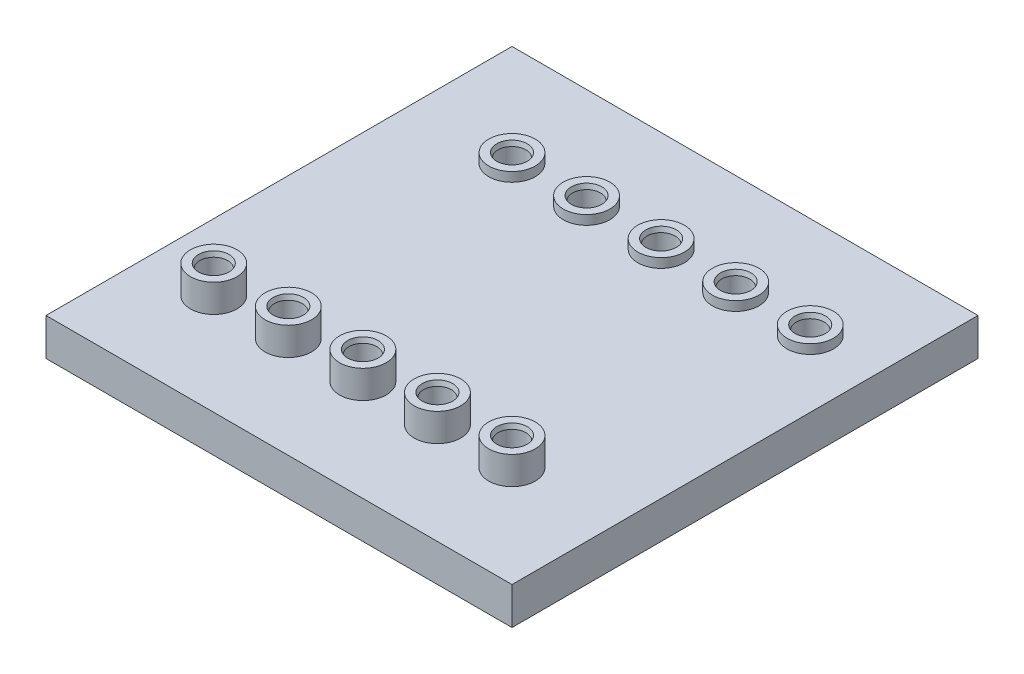
ISO-10303-21;
HEADER;
FILE_DESCRIPTION(('STEP AP214'),'2;1');
FILE_NAME('part.step','',(''),(''),'','','');
FILE_SCHEMA(('AUTOMOTIVE_DESIGN { 1 0 10303 214 1 1 1 1 }'));
ENDSEC;
DATA;
#1=APPLICATION_CONTEXT('core data for automotive mechanical design processes');
#2=APPLICATION_PROTOCOL_DEFINITION('international standard','automotive_design',2000,#1);
#3=PRODUCT_CONTEXT('',#1,'mechanical');
#4=PRODUCT('Part','Part','',(#3));
#5=PRODUCT_RELATED_PRODUCT_CATEGORY('part','',(#4));
#6=PRODUCT_DEFINITION_FORMATION('','',#4);
#7=PRODUCT_DEFINITION_CONTEXT('part definition',#1,'design');
#8=PRODUCT_DEFINITION('design','',#6,#7);
#9=PRODUCT_DEFINITION_SHAPE('','',#8);
#10=(LENGTH_UNIT() NAMED_UNIT(*) SI_UNIT(.MILLI.,.METRE.));
#11=(NAMED_UNIT(*) PLANE_ANGLE_UNIT() SI_UNIT($,.RADIAN.));
#12=(NAMED_UNIT(*) SI_UNIT($,.STERADIAN.) SOLID_ANGLE_UNIT());
#13=UNCERTAINTY_MEASURE_WITH_UNIT(LENGTH_MEASURE(1.E-05),#10,'distance_accuracy_value','');
#14=(GEOMETRIC_REPRESENTATION_CONTEXT(3) GLOBAL_UNCERTAINTY_ASSIGNED_CONTEXT((#13)) GLOBAL_UNIT_ASSIGNED_CONTEXT((#10,
#11,#12)) REPRESENTATION_CONTEXT('',''));
#15=CARTESIAN_POINT('',(0.,0.,0.));
#16=DIRECTION('',(0.,0.,1.));
#17=DIRECTION('',(1.,0.,0.));
#18=AXIS2_PLACEMENT_3D('',#15,#16,#17);
#19=CARTESIAN_POINT('',(-25.,4.,25.));
#20=DIRECTION('',(-1.,0.,0.));
#21=DIRECTION('',(0.,0.,1.));
#22=AXIS2_PLACEMENT_3D('',#19,#20,#21);
#23=PLANE('',#22);
#24=DIRECTION('',(0.,0.,-1.));
#25=VECTOR('',#24,1.);
#26=CARTESIAN_POINT('',(-25.,0.,25.));
#27=LINE('',#26,#25);
#28=CARTESIAN_POINT('',(-25.,0.,25.));
#29=VERTEX_POINT('',#28);
#30=CARTESIAN_POINT('',(-25.,0.,-25.));
#31=VERTEX_POINT('',#30);
#32=EDGE_CURVE('E99',#29,#31,#27,.T.);
#33=ORIENTED_EDGE('',*,*,#32,.F.);
#34=DIRECTION('',(0.,-1.,0.));
#35=VECTOR('',#34,1.);
#36=CARTESIAN_POINT('',(-25.,4.,25.));
#37=LINE('',#36,#35);
#38=CARTESIAN_POINT('',(-25.,4.,25.));
#39=VERTEX_POINT('',#38);
#40=EDGE_CURVE('E11',#39,#29,#37,.T.);
#41=ORIENTED_EDGE('',*,*,#40,.F.);
#42=DIRECTION('',(0.,0.,-1.));
#43=VECTOR('',#42,1.);
#44=CARTESIAN_POINT('',(-25.,4.,25.));
#45=LINE('',#44,#43);
#46=CARTESIAN_POINT('',(-25.,4.,-25.));
#47=VERTEX_POINT('',#46);
#48=EDGE_CURVE('E93',#39,#47,#45,.T.);
#49=ORIENTED_EDGE('',*,*,#48,.T.);
#50=DIRECTION('',(0.,-1.,0.));
#51=VECTOR('',#50,1.);
#52=CARTESIAN_POINT('',(-25.,4.,-25.));
#53=LINE('',#52,#51);
#54=EDGE_CURVE('E36',#47,#31,#53,.T.);
#55=ORIENTED_EDGE('',*,*,#54,.T.);
#56=EDGE_LOOP('',(#33,#41,#49,#55));
#57=FACE_BOUND('',#56,.T.);
#58=ADVANCED_FACE('F33',(#57),#23,.T.);
#59=CARTESIAN_POINT('',(-25.,4.,25.));
#60=DIRECTION('',(0.,0.,-1.));
#61=DIRECTION('',(-1.,0.,0.));
#62=AXIS2_PLACEMENT_3D('',#59,#60,#61);
#63=PLANE('',#62);
#64=DIRECTION('',(1.,0.,0.));
#65=VECTOR('',#64,1.);
#66=CARTESIAN_POINT('',(-25.,0.,25.));
#67=LINE('',#66,#65);
#68=CARTESIAN_POINT('',(25.,0.,25.));
#69=VERTEX_POINT('',#68);
#70=EDGE_CURVE('E66',#29,#69,#67,.T.);
#71=ORIENTED_EDGE('',*,*,#70,.T.);
#72=DIRECTION('',(0.,-1.,0.));
#73=VECTOR('',#72,1.);
#74=CARTESIAN_POINT('',(25.,4.,25.));
#75=LINE('',#74,#73);
#76=CARTESIAN_POINT('',(25.,4.,25.));
#77=VERTEX_POINT('',#76);
#78=EDGE_CURVE('E42',#77,#69,#75,.T.);
#79=ORIENTED_EDGE('',*,*,#78,.F.);
#80=DIRECTION('',(1.,0.,0.));
#81=VECTOR('',#80,1.);
#82=CARTESIAN_POINT('',(-25.,4.,25.));
#83=LINE('',#82,#81);
#84=EDGE_CURVE('E83',#39,#77,#83,.T.);
#85=ORIENTED_EDGE('',*,*,#84,.F.);
#86=ORIENTED_EDGE('',*,*,#40,.T.);
#87=EDGE_LOOP('',(#71,#79,#85,#86));
#88=FACE_BOUND('',#87,.T.);
#89=ADVANCED_FACE('F110',(#88),#63,.F.);
#90=CARTESIAN_POINT('',(25.,4.,25.));
#91=DIRECTION('',(-1.,0.,0.));
#92=DIRECTION('',(0.,0.,1.));
#93=AXIS2_PLACEMENT_3D('',#90,#91,#92);
#94=PLANE('',#93);
#95=DIRECTION('',(0.,0.,-1.));
#96=VECTOR('',#95,1.);
#97=CARTESIAN_POINT('',(25.,0.,25.));
#98=LINE('',#97,#96);
#99=CARTESIAN_POINT('',(25.,0.,-25.));
#100=VERTEX_POINT('',#99);
#101=EDGE_CURVE('E90',#69,#100,#98,.T.);
#102=ORIENTED_EDGE('',*,*,#101,.T.);
#103=DIRECTION('',(0.,-1.,0.));
#104=VECTOR('',#103,1.);
#105=CARTESIAN_POINT('',(25.,4.,-25.));
#106=LINE('',#105,#104);
#107=CARTESIAN_POINT('',(25.,4.,-25.));
#108=VERTEX_POINT('',#107);
#109=EDGE_CURVE('E87',#108,#100,#106,.T.);
#110=ORIENTED_EDGE('',*,*,#109,.F.);
#111=DIRECTION('',(0.,0.,-1.));
#112=VECTOR('',#111,1.);
#113=CARTESIAN_POINT('',(25.,4.,25.));
#114=LINE('',#113,#112);
#115=EDGE_CURVE('E78',#77,#108,#114,.T.);
#116=ORIENTED_EDGE('',*,*,#115,.F.);
#117=ORIENTED_EDGE('',*,*,#78,.T.);
#118=EDGE_LOOP('',(#102,#110,#116,#117));
#119=FACE_BOUND('',#118,.T.);
#120=ADVANCED_FACE('F88',(#119),#94,.F.);
#121=CARTESIAN_POINT('',(-25.,4.,-25.));
#122=DIRECTION('',(0.,0.,-1.));
#123=DIRECTION('',(-1.,0.,0.));
#124=AXIS2_PLACEMENT_3D('',#121,#122,#123);
#125=PLANE('',#124);
#126=DIRECTION('',(1.,0.,0.));
#127=VECTOR('',#126,1.);
#128=CARTESIAN_POINT('',(-25.,0.,-25.));
#129=LINE('',#128,#127);
#130=EDGE_CURVE('E102',#31,#100,#129,.T.);
#131=ORIENTED_EDGE('',*,*,#130,.F.);
#132=ORIENTED_EDGE('',*,*,#54,.F.);
#133=DIRECTION('',(1.,0.,0.));
#134=VECTOR('',#133,1.);
#135=CARTESIAN_POINT('',(-25.,4.,-25.));
#136=LINE('',#135,#134);
#137=EDGE_CURVE('E82',#47,#108,#136,.T.);
#138=ORIENTED_EDGE('',*,*,#137,.T.);
#139=ORIENTED_EDGE('',*,*,#109,.T.);
#140=EDGE_LOOP('',(#131,#132,#138,#139));
#141=FACE_BOUND('',#140,.T.);
#142=ADVANCED_FACE('F92',(#141),#125,.T.);
#143=CARTESIAN_POINT('',(0.,4.,0.));
#144=DIRECTION('',(0.,-1.,0.));
#145=DIRECTION('',(0.,0.,-1.));
#146=AXIS2_PLACEMENT_3D('',#143,#144,#145);
#147=PLANE('',#146);
#148=CARTESIAN_POINT('',(6.14213562373095,4.,14.142135623731));
#149=DIRECTION('',(0.,-1.,0.));
#150=DIRECTION('',(0.,0.,-1.));
#151=AXIS2_PLACEMENT_3D('',#148,#149,#150);
#152=CIRCLE('',#151,2.5);
#153=CARTESIAN_POINT('',(6.14213562373095,4.,11.642135623731));
#154=VERTEX_POINT('',#153);
#155=EDGE_CURVE('E428',#154,#154,#152,.T.);
#156=ORIENTED_EDGE('',*,*,#155,.T.);
#157=EDGE_LOOP('',(#156));
#158=FACE_BOUND('',#157,.T.);
#159=CARTESIAN_POINT('',(-1.85786437626905,4.,14.142135623731));
#160=DIRECTION('',(0.,-1.,0.));
#161=DIRECTION('',(0.,0.,-1.));
#162=AXIS2_PLACEMENT_3D('',#159,#160,#161);
#163=CIRCLE('',#162,2.5);
#164=CARTESIAN_POINT('',(-1.85786437626905,4.,11.642135623731));
#165=VERTEX_POINT('',#164);
#166=EDGE_CURVE('E433',#165,#165,#163,.T.);
#167=ORIENTED_EDGE('',*,*,#166,.T.);
#168=EDGE_LOOP('',(#167));
#169=FACE_BOUND('',#168,.T.);
#170=CARTESIAN_POINT('',(-9.85786437626905,4.,14.142135623731));
#171=DIRECTION('',(0.,-1.,0.));
#172=DIRECTION('',(0.,0.,-1.));
#173=AXIS2_PLACEMENT_3D('',#170,#171,#172);
#174=CIRCLE('',#173,2.5);
#175=CARTESIAN_POINT('',(-9.85786437626905,4.,11.642135623731));
#176=VERTEX_POINT('',#175);
#177=EDGE_CURVE('E439',#176,#176,#174,.T.);
#178=ORIENTED_EDGE('',*,*,#177,.T.);
#179=EDGE_LOOP('',(#178));
#180=FACE_BOUND('',#179,.T.);
#181=CARTESIAN_POINT('',(-17.8578643762691,4.,14.142135623731));
#182=DIRECTION('',(0.,-1.,0.));
#183=DIRECTION('',(0.,0.,-1.));
#184=AXIS2_PLACEMENT_3D('',#181,#182,#183);
#185=CIRCLE('',#184,2.5);
#186=CARTESIAN_POINT('',(-17.8578643762691,4.,11.642135623731));
#187=VERTEX_POINT('',#186);
#188=EDGE_CURVE('E445',#187,#187,#185,.T.);
#189=ORIENTED_EDGE('',*,*,#188,.T.);
#190=EDGE_LOOP('',(#189));
#191=FACE_BOUND('',#190,.T.);
#192=CARTESIAN_POINT('',(14.1421356237309,4.,14.142135623731));
#193=DIRECTION('',(0.,-1.,0.));
#194=DIRECTION('',(0.,0.,-1.));
#195=AXIS2_PLACEMENT_3D('',#192,#193,#194);
#196=CIRCLE('',#195,2.5);
#197=CARTESIAN_POINT('',(14.1421356237309,4.,11.6421356237309));
#198=VERTEX_POINT('',#197);
#199=EDGE_CURVE('E448',#198,#198,#196,.T.);
#200=ORIENTED_EDGE('',*,*,#199,.T.);
#201=EDGE_LOOP('',(#200));
#202=FACE_BOUND('',#201,.T.);
#203=CARTESIAN_POINT('',(17.8578643762691,4.,-14.1421356237309));
#204=DIRECTION('',(0.,-1.,0.));
#205=DIRECTION('',(0.,0.,-1.));
#206=AXIS2_PLACEMENT_3D('',#203,#204,#205);
#207=CIRCLE('',#206,2.5);
#208=CARTESIAN_POINT('',(17.8578643762691,4.,-16.6421356237309));
#209=VERTEX_POINT('',#208);
#210=EDGE_CURVE('E457',#209,#209,#207,.T.);
#211=ORIENTED_EDGE('',*,*,#210,.T.);
#212=EDGE_LOOP('',(#211));
#213=FACE_BOUND('',#212,.T.);
#214=CARTESIAN_POINT('',(9.85786437626905,4.,-14.1421356237309));
#215=DIRECTION('',(0.,-1.,0.));
#216=DIRECTION('',(0.,0.,-1.));
#217=AXIS2_PLACEMENT_3D('',#214,#215,#216);
#218=CIRCLE('',#217,2.5);
#219=CARTESIAN_POINT('',(9.85786437626905,4.,-16.642135623731));
#220=VERTEX_POINT('',#219);
#221=EDGE_CURVE('E463',#220,#220,#218,.T.);
#222=ORIENTED_EDGE('',*,*,#221,.T.);
#223=EDGE_LOOP('',(#222));
#224=FACE_BOUND('',#223,.T.);
#225=CARTESIAN_POINT('',(1.85786437626905,4.,-14.1421356237309));
#226=DIRECTION('',(0.,-1.,0.));
#227=DIRECTION('',(0.,0.,-1.));
#228=AXIS2_PLACEMENT_3D('',#225,#226,#227);
#229=CIRCLE('',#228,2.5);
#230=CARTESIAN_POINT('',(1.85786437626905,4.,-16.6421356237309));
#231=VERTEX_POINT('',#230);
#232=EDGE_CURVE('E469',#231,#231,#229,.T.);
#233=ORIENTED_EDGE('',*,*,#232,.T.);
#234=EDGE_LOOP('',(#233));
#235=FACE_BOUND('',#234,.T.);
#236=CARTESIAN_POINT('',(-6.14213562373095,4.,-14.1421356237309));
#237=DIRECTION('',(0.,-1.,0.));
#238=DIRECTION('',(0.,0.,-1.));
#239=AXIS2_PLACEMENT_3D('',#236,#237,#238);
#240=CIRCLE('',#239,2.5);
#241=CARTESIAN_POINT('',(-6.14213562373095,4.,-16.6421356237309));
#242=VERTEX_POINT('',#241);
#243=EDGE_CURVE('E475',#242,#242,#240,.T.);
#244=ORIENTED_EDGE('',*,*,#243,.T.);
#245=EDGE_LOOP('',(#244));
#246=FACE_BOUND('',#245,.T.);
#247=CARTESIAN_POINT('',(-14.142135623731,4.,-14.1421356237309));
#248=DIRECTION('',(0.,-1.,0.));
#249=DIRECTION('',(0.,0.,-1.));
#250=AXIS2_PLACEMENT_3D('',#247,#248,#249);
#251=CIRCLE('',#250,2.5);
#252=CARTESIAN_POINT('',(-14.142135623731,4.,-16.642135623731));
#253=VERTEX_POINT('',#252);
#254=EDGE_CURVE('E478',#253,#253,#251,.T.);
#255=ORIENTED_EDGE('',*,*,#254,.T.);
#256=EDGE_LOOP('',(#255));
#257=FACE_BOUND('',#256,.T.);
#258=ORIENTED_EDGE('',*,*,#48,.F.);
#259=ORIENTED_EDGE('',*,*,#84,.T.);
#260=ORIENTED_EDGE('',*,*,#115,.T.);
#261=ORIENTED_EDGE('',*,*,#137,.F.);
#262=EDGE_LOOP('',(#258,#259,#260,#261));
#263=FACE_BOUND('',#262,.T.);
#264=ADVANCED_FACE('F81',(#158,#169,#180,#191,#202,#213,#224,#235,#246,#257,#263),#147,.F.);
#265=CARTESIAN_POINT('',(0.,0.,0.));
#266=DIRECTION('',(0.,-1.,0.));
#267=DIRECTION('',(0.,0.,-1.));
#268=AXIS2_PLACEMENT_3D('',#265,#266,#267);
#269=PLANE('',#268);
#270=ORIENTED_EDGE('',*,*,#32,.T.);
#271=ORIENTED_EDGE('',*,*,#130,.T.);
#272=ORIENTED_EDGE('',*,*,#101,.F.);
#273=ORIENTED_EDGE('',*,*,#70,.F.);
#274=EDGE_LOOP('',(#270,#271,#272,#273));
#275=FACE_BOUND('',#274,.T.);
#276=ADVANCED_FACE('F108',(#275),#269,.T.);
#277=CARTESIAN_POINT('',(-14.142135623731,5.,-14.1421356237309));
#278=DIRECTION('',(0.,-1.,0.));
#279=DIRECTION('',(0.,0.,-1.));
#280=AXIS2_PLACEMENT_3D('',#277,#278,#279);
#281=CYLINDRICAL_SURFACE('',#280,2.5);
#282=CARTESIAN_POINT('',(-14.142135623731,5.,-14.1421356237309));
#283=DIRECTION('',(0.,-1.,0.));
#284=DIRECTION('',(0.,0.,-1.));
#285=AXIS2_PLACEMENT_3D('',#282,#283,#284);
#286=CIRCLE('',#285,2.5);
#287=CARTESIAN_POINT('',(-14.142135623731,5.,-16.642135623731));
#288=VERTEX_POINT('',#287);
#289=EDGE_CURVE('E103',#288,#288,#286,.T.);
#290=ORIENTED_EDGE('',*,*,#289,.T.);
#291=EDGE_LOOP('',(#290));
#292=FACE_BOUND('',#291,.T.);
#293=ORIENTED_EDGE('',*,*,#254,.F.);
#294=EDGE_LOOP('',(#293));
#295=FACE_BOUND('',#294,.T.);
#296=ADVANCED_FACE('F129',(#292,#295),#281,.T.);
#297=CARTESIAN_POINT('',(-14.142135623731,5.,-14.1421356237309));
#298=DIRECTION('',(0.,-1.,0.));
#299=DIRECTION('',(0.,0.,-1.));
#300=AXIS2_PLACEMENT_3D('',#297,#298,#299);
#301=PLANE('',#300);
#302=CARTESIAN_POINT('',(-14.142135623731,5.,-14.1421356237309));
#303=DIRECTION('',(0.,1.,0.));
#304=DIRECTION('',(0.,0.,1.));
#305=AXIS2_PLACEMENT_3D('',#302,#303,#304);
#306=CIRCLE('',#305,1.635);
#307=CARTESIAN_POINT('',(-14.142135623731,5.,-12.5071356237309));
#308=VERTEX_POINT('',#307);
#309=EDGE_CURVE('E382',#308,#308,#306,.T.);
#310=ORIENTED_EDGE('',*,*,#309,.F.);
#311=EDGE_LOOP('',(#310));
#312=FACE_BOUND('',#311,.T.);
#313=ORIENTED_EDGE('',*,*,#289,.F.);
#314=EDGE_LOOP('',(#313));
#315=FACE_BOUND('',#314,.T.);
#316=ADVANCED_FACE('F135',(#312,#315),#301,.F.);
#317=CARTESIAN_POINT('',(-6.14213562373095,5.,-14.1421356237309));
#318=DIRECTION('',(0.,-1.,0.));
#319=DIRECTION('',(0.,0.,-1.));
#320=AXIS2_PLACEMENT_3D('',#317,#318,#319);
#321=CYLINDRICAL_SURFACE('',#320,2.5);
#322=CARTESIAN_POINT('',(-6.14213562373095,5.,-14.1421356237309));
#323=DIRECTION('',(0.,-1.,0.));
#324=DIRECTION('',(0.,0.,-1.));
#325=AXIS2_PLACEMENT_3D('',#322,#323,#324);
#326=CIRCLE('',#325,2.5);
#327=CARTESIAN_POINT('',(-6.14213562373095,5.,-16.6421356237309));
#328=VERTEX_POINT('',#327);
#329=EDGE_CURVE('E472',#328,#328,#326,.T.);
#330=ORIENTED_EDGE('',*,*,#329,.T.);
#331=EDGE_LOOP('',(#330));
#332=FACE_BOUND('',#331,.T.);
#333=ORIENTED_EDGE('',*,*,#243,.F.);
#334=EDGE_LOOP('',(#333));
#335=FACE_BOUND('',#334,.T.);
#336=ADVANCED_FACE('F139',(#332,#335),#321,.T.);
#337=CARTESIAN_POINT('',(-6.14213562373095,5.,-14.1421356237309));
#338=DIRECTION('',(0.,-1.,0.));
#339=DIRECTION('',(0.,0.,-1.));
#340=AXIS2_PLACEMENT_3D('',#337,#338,#339);
#341=PLANE('',#340);
#342=CARTESIAN_POINT('',(-6.14213562373095,5.,-14.1421356237309));
#343=DIRECTION('',(0.,1.,0.));
#344=DIRECTION('',(0.,0.,1.));
#345=AXIS2_PLACEMENT_3D('',#342,#343,#344);
#346=CIRCLE('',#345,1.635);
#347=CARTESIAN_POINT('',(-6.14213562373095,5.,-12.5071356237309));
#348=VERTEX_POINT('',#347);
#349=EDGE_CURVE('E391',#348,#348,#346,.T.);
#350=ORIENTED_EDGE('',*,*,#349,.F.);
#351=EDGE_LOOP('',(#350));
#352=FACE_BOUND('',#351,.T.);
#353=ORIENTED_EDGE('',*,*,#329,.F.);
#354=EDGE_LOOP('',(#353));
#355=FACE_BOUND('',#354,.T.);
#356=ADVANCED_FACE('F141',(#352,#355),#341,.F.);
#357=CARTESIAN_POINT('',(1.85786437626905,5.,-14.1421356237309));
#358=DIRECTION('',(0.,-1.,0.));
#359=DIRECTION('',(0.,0.,-1.));
#360=AXIS2_PLACEMENT_3D('',#357,#358,#359);
#361=CYLINDRICAL_SURFACE('',#360,2.5);
#362=CARTESIAN_POINT('',(1.85786437626905,5.,-14.1421356237309));
#363=DIRECTION('',(0.,-1.,0.));
#364=DIRECTION('',(0.,0.,-1.));
#365=AXIS2_PLACEMENT_3D('',#362,#363,#364);
#366=CIRCLE('',#365,2.5);
#367=CARTESIAN_POINT('',(1.85786437626905,5.,-16.6421356237309));
#368=VERTEX_POINT('',#367);
#369=EDGE_CURVE('E466',#368,#368,#366,.T.);
#370=ORIENTED_EDGE('',*,*,#369,.T.);
#371=EDGE_LOOP('',(#370));
#372=FACE_BOUND('',#371,.T.);
#373=ORIENTED_EDGE('',*,*,#232,.F.);
#374=EDGE_LOOP('',(#373));
#375=FACE_BOUND('',#374,.T.);
#376=ADVANCED_FACE('F144',(#372,#375),#361,.T.);
#377=CARTESIAN_POINT('',(1.85786437626905,5.,-14.1421356237309));
#378=DIRECTION('',(0.,-1.,0.));
#379=DIRECTION('',(0.,0.,-1.));
#380=AXIS2_PLACEMENT_3D('',#377,#378,#379);
#381=PLANE('',#380);
#382=CARTESIAN_POINT('',(1.85786437626905,5.,-14.1421356237309));
#383=DIRECTION('',(0.,1.,0.));
#384=DIRECTION('',(0.,0.,1.));
#385=AXIS2_PLACEMENT_3D('',#382,#383,#384);
#386=CIRCLE('',#385,1.635);
#387=CARTESIAN_POINT('',(1.85786437626905,5.,-12.5071356237309));
#388=VERTEX_POINT('',#387);
#389=EDGE_CURVE('E400',#388,#388,#386,.T.);
#390=ORIENTED_EDGE('',*,*,#389,.F.);
#391=EDGE_LOOP('',(#390));
#392=FACE_BOUND('',#391,.T.);
#393=ORIENTED_EDGE('',*,*,#369,.F.);
#394=EDGE_LOOP('',(#393));
#395=FACE_BOUND('',#394,.T.);
#396=ADVANCED_FACE('F149',(#392,#395),#381,.F.);
#397=CARTESIAN_POINT('',(9.85786437626905,5.,-14.1421356237309));
#398=DIRECTION('',(0.,-1.,0.));
#399=DIRECTION('',(0.,0.,-1.));
#400=AXIS2_PLACEMENT_3D('',#397,#398,#399);
#401=CYLINDRICAL_SURFACE('',#400,2.5);
#402=CARTESIAN_POINT('',(9.85786437626905,5.,-14.1421356237309));
#403=DIRECTION('',(0.,-1.,0.));
#404=DIRECTION('',(0.,0.,-1.));
#405=AXIS2_PLACEMENT_3D('',#402,#403,#404);
#406=CIRCLE('',#405,2.5);
#407=CARTESIAN_POINT('',(9.85786437626905,5.,-16.642135623731));
#408=VERTEX_POINT('',#407);
#409=EDGE_CURVE('E460',#408,#408,#406,.T.);
#410=ORIENTED_EDGE('',*,*,#409,.T.);
#411=EDGE_LOOP('',(#410));
#412=FACE_BOUND('',#411,.T.);
#413=ORIENTED_EDGE('',*,*,#221,.F.);
#414=EDGE_LOOP('',(#413));
#415=FACE_BOUND('',#414,.T.);
#416=ADVANCED_FACE('F152',(#412,#415),#401,.T.);
#417=CARTESIAN_POINT('',(9.85786437626905,5.,-14.1421356237309));
#418=DIRECTION('',(0.,-1.,0.));
#419=DIRECTION('',(0.,0.,-1.));
#420=AXIS2_PLACEMENT_3D('',#417,#418,#419);
#421=PLANE('',#420);
#422=CARTESIAN_POINT('',(9.85786437626905,5.,-14.1421356237309));
#423=DIRECTION('',(0.,1.,0.));
#424=DIRECTION('',(0.,0.,1.));
#425=AXIS2_PLACEMENT_3D('',#422,#423,#424);
#426=CIRCLE('',#425,1.635);
#427=CARTESIAN_POINT('',(9.85786437626905,5.,-12.5071356237309));
#428=VERTEX_POINT('',#427);
#429=EDGE_CURVE('E409',#428,#428,#426,.T.);
#430=ORIENTED_EDGE('',*,*,#429,.F.);
#431=EDGE_LOOP('',(#430));
#432=FACE_BOUND('',#431,.T.);
#433=ORIENTED_EDGE('',*,*,#409,.F.);
#434=EDGE_LOOP('',(#433));
#435=FACE_BOUND('',#434,.T.);
#436=ADVANCED_FACE('F157',(#432,#435),#421,.F.);
#437=CARTESIAN_POINT('',(17.8578643762691,5.,-14.1421356237309));
#438=DIRECTION('',(0.,-1.,0.));
#439=DIRECTION('',(0.,0.,-1.));
#440=AXIS2_PLACEMENT_3D('',#437,#438,#439);
#441=CYLINDRICAL_SURFACE('',#440,2.5);
#442=CARTESIAN_POINT('',(17.8578643762691,5.,-14.1421356237309));
#443=DIRECTION('',(0.,-1.,0.));
#444=DIRECTION('',(0.,0.,-1.));
#445=AXIS2_PLACEMENT_3D('',#442,#443,#444);
#446=CIRCLE('',#445,2.5);
#447=CARTESIAN_POINT('',(17.8578643762691,5.,-16.6421356237309));
#448=VERTEX_POINT('',#447);
#449=EDGE_CURVE('E454',#448,#448,#446,.T.);
#450=ORIENTED_EDGE('',*,*,#449,.T.);
#451=EDGE_LOOP('',(#450));
#452=FACE_BOUND('',#451,.T.);
#453=ORIENTED_EDGE('',*,*,#210,.F.);
#454=EDGE_LOOP('',(#453));
#455=FACE_BOUND('',#454,.T.);
#456=ADVANCED_FACE('F160',(#452,#455),#441,.T.);
#457=CARTESIAN_POINT('',(17.8578643762691,5.,-14.1421356237309));
#458=DIRECTION('',(0.,-1.,0.));
#459=DIRECTION('',(0.,0.,-1.));
#460=AXIS2_PLACEMENT_3D('',#457,#458,#459);
#461=PLANE('',#460);
#462=CARTESIAN_POINT('',(17.8578643762691,5.,-14.1421356237309));
#463=DIRECTION('',(0.,1.,0.));
#464=DIRECTION('',(0.,0.,1.));
#465=AXIS2_PLACEMENT_3D('',#462,#463,#464);
#466=CIRCLE('',#465,1.635);
#467=CARTESIAN_POINT('',(17.8578643762691,5.,-12.507135623731));
#468=VERTEX_POINT('',#467);
#469=EDGE_CURVE('E418',#468,#468,#466,.T.);
#470=ORIENTED_EDGE('',*,*,#469,.F.);
#471=EDGE_LOOP('',(#470));
#472=FACE_BOUND('',#471,.T.);
#473=ORIENTED_EDGE('',*,*,#449,.F.);
#474=EDGE_LOOP('',(#473));
#475=FACE_BOUND('',#474,.T.);
#476=ADVANCED_FACE('F165',(#472,#475),#461,.F.);
#477=CARTESIAN_POINT('',(14.1421356237309,7.,14.142135623731));
#478=DIRECTION('',(0.,-1.,0.));
#479=DIRECTION('',(0.,0.,-1.));
#480=AXIS2_PLACEMENT_3D('',#477,#478,#479);
#481=CYLINDRICAL_SURFACE('',#480,2.5);
#482=CARTESIAN_POINT('',(14.1421356237309,7.,14.142135623731));
#483=DIRECTION('',(0.,-1.,0.));
#484=DIRECTION('',(0.,0.,-1.));
#485=AXIS2_PLACEMENT_3D('',#482,#483,#484);
#486=CIRCLE('',#485,2.5);
#487=CARTESIAN_POINT('',(14.1421356237309,7.,11.6421356237309));
#488=VERTEX_POINT('',#487);
#489=EDGE_CURVE('E451',#488,#488,#486,.T.);
#490=ORIENTED_EDGE('',*,*,#489,.T.);
#491=EDGE_LOOP('',(#490));
#492=FACE_BOUND('',#491,.T.);
#493=ORIENTED_EDGE('',*,*,#199,.F.);
#494=EDGE_LOOP('',(#493));
#495=FACE_BOUND('',#494,.T.);
#496=ADVANCED_FACE('F168',(#492,#495),#481,.T.);
#497=CARTESIAN_POINT('',(14.1421356237309,7.,14.142135623731));
#498=DIRECTION('',(0.,-1.,0.));
#499=DIRECTION('',(0.,0.,-1.));
#500=AXIS2_PLACEMENT_3D('',#497,#498,#499);
#501=PLANE('',#500);
#502=CARTESIAN_POINT('',(14.1421356237309,7.,14.142135623731));
#503=DIRECTION('',(0.,1.,0.));
#504=DIRECTION('',(0.,0.,1.));
#505=AXIS2_PLACEMENT_3D('',#502,#503,#504);
#506=CIRCLE('',#505,1.635);
#507=CARTESIAN_POINT('',(14.1421356237309,7.,15.777135623731));
#508=VERTEX_POINT('',#507);
#509=EDGE_CURVE('E339',#508,#508,#506,.T.);
#510=ORIENTED_EDGE('',*,*,#509,.F.);
#511=EDGE_LOOP('',(#510));
#512=FACE_BOUND('',#511,.T.);
#513=ORIENTED_EDGE('',*,*,#489,.F.);
#514=EDGE_LOOP('',(#513));
#515=FACE_BOUND('',#514,.T.);
#516=ADVANCED_FACE('F175',(#512,#515),#501,.F.);
#517=CARTESIAN_POINT('',(-17.8578643762691,7.,14.142135623731));
#518=DIRECTION('',(0.,-1.,0.));
#519=DIRECTION('',(0.,0.,-1.));
#520=AXIS2_PLACEMENT_3D('',#517,#518,#519);
#521=CYLINDRICAL_SURFACE('',#520,2.5);
#522=CARTESIAN_POINT('',(-17.8578643762691,7.,14.142135623731));
#523=DIRECTION('',(0.,-1.,0.));
#524=DIRECTION('',(0.,0.,-1.));
#525=AXIS2_PLACEMENT_3D('',#522,#523,#524);
#526=CIRCLE('',#525,2.5);
#527=CARTESIAN_POINT('',(-17.8578643762691,7.,11.642135623731));
#528=VERTEX_POINT('',#527);
#529=EDGE_CURVE('E442',#528,#528,#526,.T.);
#530=ORIENTED_EDGE('',*,*,#529,.T.);
#531=EDGE_LOOP('',(#530));
#532=FACE_BOUND('',#531,.T.);
#533=ORIENTED_EDGE('',*,*,#188,.F.);
#534=EDGE_LOOP('',(#533));
#535=FACE_BOUND('',#534,.T.);
#536=ADVANCED_FACE('F179',(#532,#535),#521,.T.);
#537=CARTESIAN_POINT('',(-17.8578643762691,7.,14.142135623731));
#538=DIRECTION('',(0.,-1.,0.));
#539=DIRECTION('',(0.,0.,-1.));
#540=AXIS2_PLACEMENT_3D('',#537,#538,#539);
#541=PLANE('',#540);
#542=CARTESIAN_POINT('',(-17.8578643762691,7.,14.142135623731));
#543=DIRECTION('',(0.,1.,0.));
#544=DIRECTION('',(0.,0.,1.));
#545=AXIS2_PLACEMENT_3D('',#542,#543,#544);
#546=CIRCLE('',#545,1.635);
#547=CARTESIAN_POINT('',(-17.8578643762691,7.,15.777135623731));
#548=VERTEX_POINT('',#547);
#549=EDGE_CURVE('E346',#548,#548,#546,.T.);
#550=ORIENTED_EDGE('',*,*,#549,.F.);
#551=EDGE_LOOP('',(#550));
#552=FACE_BOUND('',#551,.T.);
#553=ORIENTED_EDGE('',*,*,#529,.F.);
#554=EDGE_LOOP('',(#553));
#555=FACE_BOUND('',#554,.T.);
#556=ADVANCED_FACE('F181',(#552,#555),#541,.F.);
#557=CARTESIAN_POINT('',(-9.85786437626905,7.,14.142135623731));
#558=DIRECTION('',(0.,-1.,0.));
#559=DIRECTION('',(0.,0.,-1.));
#560=AXIS2_PLACEMENT_3D('',#557,#558,#559);
#561=CYLINDRICAL_SURFACE('',#560,2.5);
#562=CARTESIAN_POINT('',(-9.85786437626905,7.,14.142135623731));
#563=DIRECTION('',(0.,-1.,0.));
#564=DIRECTION('',(0.,0.,-1.));
#565=AXIS2_PLACEMENT_3D('',#562,#563,#564);
#566=CIRCLE('',#565,2.5);
#567=CARTESIAN_POINT('',(-9.85786437626905,7.,11.642135623731));
#568=VERTEX_POINT('',#567);
#569=EDGE_CURVE('E436',#568,#568,#566,.T.);
#570=ORIENTED_EDGE('',*,*,#569,.T.);
#571=EDGE_LOOP('',(#570));
#572=FACE_BOUND('',#571,.T.);
#573=ORIENTED_EDGE('',*,*,#177,.F.);
#574=EDGE_LOOP('',(#573));
#575=FACE_BOUND('',#574,.T.);
#576=ADVANCED_FACE('F184',(#572,#575),#561,.T.);
#577=CARTESIAN_POINT('',(-9.85786437626905,7.,14.142135623731));
#578=DIRECTION('',(0.,-1.,0.));
#579=DIRECTION('',(0.,0.,-1.));
#580=AXIS2_PLACEMENT_3D('',#577,#578,#579);
#581=PLANE('',#580);
#582=CARTESIAN_POINT('',(-9.85786437626905,7.,14.142135623731));
#583=DIRECTION('',(0.,1.,0.));
#584=DIRECTION('',(0.,0.,1.));
#585=AXIS2_PLACEMENT_3D('',#582,#583,#584);
#586=CIRCLE('',#585,1.635);
#587=CARTESIAN_POINT('',(-9.85786437626905,7.,15.777135623731));
#588=VERTEX_POINT('',#587);
#589=EDGE_CURVE('E355',#588,#588,#586,.T.);
#590=ORIENTED_EDGE('',*,*,#589,.F.);
#591=EDGE_LOOP('',(#590));
#592=FACE_BOUND('',#591,.T.);
#593=ORIENTED_EDGE('',*,*,#569,.F.);
#594=EDGE_LOOP('',(#593));
#595=FACE_BOUND('',#594,.T.);
#596=ADVANCED_FACE('F189',(#592,#595),#581,.F.);
#597=CARTESIAN_POINT('',(-1.85786437626905,7.,14.142135623731));
#598=DIRECTION('',(0.,-1.,0.));
#599=DIRECTION('',(0.,0.,-1.));
#600=AXIS2_PLACEMENT_3D('',#597,#598,#599);
#601=CYLINDRICAL_SURFACE('',#600,2.5);
#602=CARTESIAN_POINT('',(-1.85786437626905,7.,14.142135623731));
#603=DIRECTION('',(0.,-1.,0.));
#604=DIRECTION('',(0.,0.,-1.));
#605=AXIS2_PLACEMENT_3D('',#602,#603,#604);
#606=CIRCLE('',#605,2.5);
#607=CARTESIAN_POINT('',(-1.85786437626905,7.,11.642135623731));
#608=VERTEX_POINT('',#607);
#609=EDGE_CURVE('E430',#608,#608,#606,.T.);
#610=ORIENTED_EDGE('',*,*,#609,.T.);
#611=EDGE_LOOP('',(#610));
#612=FACE_BOUND('',#611,.T.);
#613=ORIENTED_EDGE('',*,*,#166,.F.);
#614=EDGE_LOOP('',(#613));
#615=FACE_BOUND('',#614,.T.);
#616=ADVANCED_FACE('F192',(#612,#615),#601,.T.);
#617=CARTESIAN_POINT('',(-1.85786437626905,7.,14.142135623731));
#618=DIRECTION('',(0.,-1.,0.));
#619=DIRECTION('',(0.,0.,-1.));
#620=AXIS2_PLACEMENT_3D('',#617,#618,#619);
#621=PLANE('',#620);
#622=CARTESIAN_POINT('',(-1.85786437626905,7.,14.142135623731));
#623=DIRECTION('',(0.,1.,0.));
#624=DIRECTION('',(0.,0.,1.));
#625=AXIS2_PLACEMENT_3D('',#622,#623,#624);
#626=CIRCLE('',#625,1.635);
#627=CARTESIAN_POINT('',(-1.85786437626905,7.,15.777135623731));
#628=VERTEX_POINT('',#627);
#629=EDGE_CURVE('E364',#628,#628,#626,.T.);
#630=ORIENTED_EDGE('',*,*,#629,.F.);
#631=EDGE_LOOP('',(#630));
#632=FACE_BOUND('',#631,.T.);
#633=ORIENTED_EDGE('',*,*,#609,.F.);
#634=EDGE_LOOP('',(#633));
#635=FACE_BOUND('',#634,.T.);
#636=ADVANCED_FACE('F197',(#632,#635),#621,.F.);
#637=CARTESIAN_POINT('',(6.14213562373095,7.,14.142135623731));
#638=DIRECTION('',(0.,-1.,0.));
#639=DIRECTION('',(0.,0.,-1.));
#640=AXIS2_PLACEMENT_3D('',#637,#638,#639);
#641=CYLINDRICAL_SURFACE('',#640,2.5);
#642=CARTESIAN_POINT('',(6.14213562373095,7.,14.142135623731));
#643=DIRECTION('',(0.,-1.,0.));
#644=DIRECTION('',(0.,0.,-1.));
#645=AXIS2_PLACEMENT_3D('',#642,#643,#644);
#646=CIRCLE('',#645,2.5);
#647=CARTESIAN_POINT('',(6.14213562373095,7.,11.642135623731));
#648=VERTEX_POINT('',#647);
#649=EDGE_CURVE('E427',#648,#648,#646,.T.);
#650=ORIENTED_EDGE('',*,*,#649,.T.);
#651=EDGE_LOOP('',(#650));
#652=FACE_BOUND('',#651,.T.);
#653=ORIENTED_EDGE('',*,*,#155,.F.);
#654=EDGE_LOOP('',(#653));
#655=FACE_BOUND('',#654,.T.);
#656=ADVANCED_FACE('F200',(#652,#655),#641,.T.);
#657=CARTESIAN_POINT('',(6.14213562373095,7.,14.142135623731));
#658=DIRECTION('',(0.,-1.,0.));
#659=DIRECTION('',(0.,0.,-1.));
#660=AXIS2_PLACEMENT_3D('',#657,#658,#659);
#661=PLANE('',#660);
#662=CARTESIAN_POINT('',(6.14213562373095,7.,14.142135623731));
#663=DIRECTION('',(0.,1.,0.));
#664=DIRECTION('',(0.,0.,1.));
#665=AXIS2_PLACEMENT_3D('',#662,#663,#664);
#666=CIRCLE('',#665,1.635);
#667=CARTESIAN_POINT('',(6.14213562373095,7.,15.777135623731));
#668=VERTEX_POINT('',#667);
#669=EDGE_CURVE('E373',#668,#668,#666,.T.);
#670=ORIENTED_EDGE('',*,*,#669,.F.);
#671=EDGE_LOOP('',(#670));
#672=FACE_BOUND('',#671,.T.);
#673=ORIENTED_EDGE('',*,*,#649,.F.);
#674=EDGE_LOOP('',(#673));
#675=FACE_BOUND('',#674,.T.);
#676=ADVANCED_FACE('F205',(#672,#675),#661,.F.);
#677=CARTESIAN_POINT('',(17.8578643762691,1.5,-14.1421356237309));
#678=DIRECTION('',(0.,-1.,0.));
#679=DIRECTION('',(0.,0.,-1.));
#680=AXIS2_PLACEMENT_3D('',#677,#678,#679);
#681=PLANE('',#680);
#682=CARTESIAN_POINT('',(17.8578643762691,1.5,-14.1421356237309));
#683=DIRECTION('',(0.,1.,0.));
#684=DIRECTION('',(0.,0.,1.));
#685=AXIS2_PLACEMENT_3D('',#682,#683,#684);
#686=CIRCLE('',#685,1.5);
#687=CARTESIAN_POINT('',(17.8578643762691,1.5,-12.642135623731));
#688=VERTEX_POINT('',#687);
#689=EDGE_CURVE('E424',#688,#688,#686,.T.);
#690=ORIENTED_EDGE('',*,*,#689,.T.);
#691=EDGE_LOOP('',(#690));
#692=FACE_BOUND('',#691,.T.);
#693=ADVANCED_FACE('F208',(#692),#681,.F.);
#694=CARTESIAN_POINT('',(17.8578643762691,5.,-14.1421356237309));
#695=DIRECTION('',(0.,1.,0.));
#696=DIRECTION('',(0.,0.,1.));
#697=AXIS2_PLACEMENT_3D('',#694,#695,#696);
#698=CYLINDRICAL_SURFACE('',#697,1.5);
#699=ORIENTED_EDGE('',*,*,#689,.F.);
#700=EDGE_LOOP('',(#699));
#701=FACE_BOUND('',#700,.T.);
#702=CARTESIAN_POINT('',(17.8578643762691,4.4961731409782,-14.1421356237309));
#703=DIRECTION('',(0.,1.,0.));
#704=DIRECTION('',(0.,0.,1.));
#705=AXIS2_PLACEMENT_3D('',#702,#703,#704);
#706=CIRCLE('',#705,1.5);
#707=CARTESIAN_POINT('',(17.8578643762691,4.4961731409782,-12.642135623731));
#708=VERTEX_POINT('',#707);
#709=EDGE_CURVE('E421',#708,#708,#706,.T.);
#710=ORIENTED_EDGE('',*,*,#709,.T.);
#711=EDGE_LOOP('',(#710));
#712=FACE_BOUND('',#711,.T.);
#713=ADVANCED_FACE('F215',(#701,#712),#698,.F.);
#714=CARTESIAN_POINT('',(17.8578643762691,5.,-14.1421356237309));
#715=DIRECTION('',(0.,1.,0.));
#716=DIRECTION('',(0.,0.,1.));
#717=AXIS2_PLACEMENT_3D('',#714,#715,#716);
#718=CONICAL_SURFACE('',#717,1.635,0.261799387799147);
#719=ORIENTED_EDGE('',*,*,#709,.F.);
#720=EDGE_LOOP('',(#719));
#721=FACE_BOUND('',#720,.T.);
#722=ORIENTED_EDGE('',*,*,#469,.T.);
#723=EDGE_LOOP('',(#722));
#724=FACE_BOUND('',#723,.T.);
#725=ADVANCED_FACE('F219',(#721,#724),#718,.F.);
#726=CARTESIAN_POINT('',(9.85786437626905,1.5,-14.1421356237309));
#727=DIRECTION('',(0.,-1.,0.));
#728=DIRECTION('',(0.,0.,-1.));
#729=AXIS2_PLACEMENT_3D('',#726,#727,#728);
#730=PLANE('',#729);
#731=CARTESIAN_POINT('',(9.85786437626905,1.5,-14.1421356237309));
#732=DIRECTION('',(0.,1.,0.));
#733=DIRECTION('',(0.,0.,1.));
#734=AXIS2_PLACEMENT_3D('',#731,#732,#733);
#735=CIRCLE('',#734,1.5);
#736=CARTESIAN_POINT('',(9.85786437626905,1.5,-12.6421356237309));
#737=VERTEX_POINT('',#736);
#738=EDGE_CURVE('E415',#737,#737,#735,.T.);
#739=ORIENTED_EDGE('',*,*,#738,.T.);
#740=EDGE_LOOP('',(#739));
#741=FACE_BOUND('',#740,.T.);
#742=ADVANCED_FACE('F223',(#741),#730,.F.);
#743=CARTESIAN_POINT('',(9.85786437626905,5.,-14.1421356237309));
#744=DIRECTION('',(0.,1.,0.));
#745=DIRECTION('',(0.,0.,1.));
#746=AXIS2_PLACEMENT_3D('',#743,#744,#745);
#747=CYLINDRICAL_SURFACE('',#746,1.5);
#748=ORIENTED_EDGE('',*,*,#738,.F.);
#749=EDGE_LOOP('',(#748));
#750=FACE_BOUND('',#749,.T.);
#751=CARTESIAN_POINT('',(9.85786437626905,4.4961731409782,-14.1421356237309));
#752=DIRECTION('',(0.,1.,0.));
#753=DIRECTION('',(0.,0.,1.));
#754=AXIS2_PLACEMENT_3D('',#751,#752,#753);
#755=CIRCLE('',#754,1.5);
#756=CARTESIAN_POINT('',(9.85786437626905,4.4961731409782,-12.6421356237309));
#757=VERTEX_POINT('',#756);
#758=EDGE_CURVE('E412',#757,#757,#755,.T.);
#759=ORIENTED_EDGE('',*,*,#758,.T.);
#760=EDGE_LOOP('',(#759));
#761=FACE_BOUND('',#760,.T.);
#762=ADVANCED_FACE('F227',(#750,#761),#747,.F.);
#763=CARTESIAN_POINT('',(9.85786437626905,5.,-14.1421356237309));
#764=DIRECTION('',(0.,1.,0.));
#765=DIRECTION('',(0.,0.,1.));
#766=AXIS2_PLACEMENT_3D('',#763,#764,#765);
#767=CONICAL_SURFACE('',#766,1.635,0.261799387799147);
#768=ORIENTED_EDGE('',*,*,#758,.F.);
#769=EDGE_LOOP('',(#768));
#770=FACE_BOUND('',#769,.T.);
#771=ORIENTED_EDGE('',*,*,#429,.T.);
#772=EDGE_LOOP('',(#771));
#773=FACE_BOUND('',#772,.T.);
#774=ADVANCED_FACE('F231',(#770,#773),#767,.F.);
#775=CARTESIAN_POINT('',(1.85786437626905,1.5,-14.1421356237309));
#776=DIRECTION('',(0.,-1.,0.));
#777=DIRECTION('',(0.,0.,-1.));
#778=AXIS2_PLACEMENT_3D('',#775,#776,#777);
#779=PLANE('',#778);
#780=CARTESIAN_POINT('',(1.85786437626905,1.5,-14.1421356237309));
#781=DIRECTION('',(0.,1.,0.));
#782=DIRECTION('',(0.,0.,1.));
#783=AXIS2_PLACEMENT_3D('',#780,#781,#782);
#784=CIRCLE('',#783,1.5);
#785=CARTESIAN_POINT('',(1.85786437626905,1.5,-12.6421356237309));
#786=VERTEX_POINT('',#785);
#787=EDGE_CURVE('E406',#786,#786,#784,.T.);
#788=ORIENTED_EDGE('',*,*,#787,.T.);
#789=EDGE_LOOP('',(#788));
#790=FACE_BOUND('',#789,.T.);
#791=ADVANCED_FACE('F235',(#790),#779,.F.);
#792=CARTESIAN_POINT('',(1.85786437626905,5.,-14.1421356237309));
#793=DIRECTION('',(0.,1.,0.));
#794=DIRECTION('',(0.,0.,1.));
#795=AXIS2_PLACEMENT_3D('',#792,#793,#794);
#796=CYLINDRICAL_SURFACE('',#795,1.5);
#797=ORIENTED_EDGE('',*,*,#787,.F.);
#798=EDGE_LOOP('',(#797));
#799=FACE_BOUND('',#798,.T.);
#800=CARTESIAN_POINT('',(1.85786437626905,4.4961731409782,-14.1421356237309));
#801=DIRECTION('',(0.,1.,0.));
#802=DIRECTION('',(0.,0.,1.));
#803=AXIS2_PLACEMENT_3D('',#800,#801,#802);
#804=CIRCLE('',#803,1.5);
#805=CARTESIAN_POINT('',(1.85786437626905,4.4961731409782,-12.6421356237309));
#806=VERTEX_POINT('',#805);
#807=EDGE_CURVE('E403',#806,#806,#804,.T.);
#808=ORIENTED_EDGE('',*,*,#807,.T.);
#809=EDGE_LOOP('',(#808));
#810=FACE_BOUND('',#809,.T.);
#811=ADVANCED_FACE('F239',(#799,#810),#796,.F.);
#812=CARTESIAN_POINT('',(1.85786437626905,5.,-14.1421356237309));
#813=DIRECTION('',(0.,1.,0.));
#814=DIRECTION('',(0.,0.,1.));
#815=AXIS2_PLACEMENT_3D('',#812,#813,#814);
#816=CONICAL_SURFACE('',#815,1.635,0.261799387799147);
#817=ORIENTED_EDGE('',*,*,#807,.F.);
#818=EDGE_LOOP('',(#817));
#819=FACE_BOUND('',#818,.T.);
#820=ORIENTED_EDGE('',*,*,#389,.T.);
#821=EDGE_LOOP('',(#820));
#822=FACE_BOUND('',#821,.T.);
#823=ADVANCED_FACE('F243',(#819,#822),#816,.F.);
#824=CARTESIAN_POINT('',(-6.14213562373095,1.5,-14.1421356237309));
#825=DIRECTION('',(0.,-1.,0.));
#826=DIRECTION('',(0.,0.,-1.));
#827=AXIS2_PLACEMENT_3D('',#824,#825,#826);
#828=PLANE('',#827);
#829=CARTESIAN_POINT('',(-6.14213562373095,1.5,-14.1421356237309));
#830=DIRECTION('',(0.,1.,0.));
#831=DIRECTION('',(0.,0.,1.));
#832=AXIS2_PLACEMENT_3D('',#829,#830,#831);
#833=CIRCLE('',#832,1.5);
#834=CARTESIAN_POINT('',(-6.14213562373095,1.5,-12.6421356237309));
#835=VERTEX_POINT('',#834);
#836=EDGE_CURVE('E397',#835,#835,#833,.T.);
#837=ORIENTED_EDGE('',*,*,#836,.T.);
#838=EDGE_LOOP('',(#837));
#839=FACE_BOUND('',#838,.T.);
#840=ADVANCED_FACE('F247',(#839),#828,.F.);
#841=CARTESIAN_POINT('',(-6.14213562373095,5.,-14.1421356237309));
#842=DIRECTION('',(0.,1.,0.));
#843=DIRECTION('',(0.,0.,1.));
#844=AXIS2_PLACEMENT_3D('',#841,#842,#843);
#845=CYLINDRICAL_SURFACE('',#844,1.5);
#846=ORIENTED_EDGE('',*,*,#836,.F.);
#847=EDGE_LOOP('',(#846));
#848=FACE_BOUND('',#847,.T.);
#849=CARTESIAN_POINT('',(-6.14213562373095,4.4961731409782,-14.1421356237309));
#850=DIRECTION('',(0.,1.,0.));
#851=DIRECTION('',(0.,0.,1.));
#852=AXIS2_PLACEMENT_3D('',#849,#850,#851);
#853=CIRCLE('',#852,1.5);
#854=CARTESIAN_POINT('',(-6.14213562373095,4.4961731409782,-12.6421356237309));
#855=VERTEX_POINT('',#854);
#856=EDGE_CURVE('E394',#855,#855,#853,.T.);
#857=ORIENTED_EDGE('',*,*,#856,.T.);
#858=EDGE_LOOP('',(#857));
#859=FACE_BOUND('',#858,.T.);
#860=ADVANCED_FACE('F251',(#848,#859),#845,.F.);
#861=CARTESIAN_POINT('',(-6.14213562373095,5.,-14.1421356237309));
#862=DIRECTION('',(0.,1.,0.));
#863=DIRECTION('',(0.,0.,1.));
#864=AXIS2_PLACEMENT_3D('',#861,#862,#863);
#865=CONICAL_SURFACE('',#864,1.635,0.261799387799147);
#866=ORIENTED_EDGE('',*,*,#856,.F.);
#867=EDGE_LOOP('',(#866));
#868=FACE_BOUND('',#867,.T.);
#869=ORIENTED_EDGE('',*,*,#349,.T.);
#870=EDGE_LOOP('',(#869));
#871=FACE_BOUND('',#870,.T.);
#872=ADVANCED_FACE('F255',(#868,#871),#865,.F.);
#873=CARTESIAN_POINT('',(-14.142135623731,1.5,-14.1421356237309));
#874=DIRECTION('',(0.,-1.,0.));
#875=DIRECTION('',(0.,0.,-1.));
#876=AXIS2_PLACEMENT_3D('',#873,#874,#875);
#877=PLANE('',#876);
#878=CARTESIAN_POINT('',(-14.142135623731,1.5,-14.1421356237309));
#879=DIRECTION('',(0.,1.,0.));
#880=DIRECTION('',(0.,0.,1.));
#881=AXIS2_PLACEMENT_3D('',#878,#879,#880);
#882=CIRCLE('',#881,1.5);
#883=CARTESIAN_POINT('',(-14.142135623731,1.5,-12.6421356237309));
#884=VERTEX_POINT('',#883);
#885=EDGE_CURVE('E388',#884,#884,#882,.T.);
#886=ORIENTED_EDGE('',*,*,#885,.T.);
#887=EDGE_LOOP('',(#886));
#888=FACE_BOUND('',#887,.T.);
#889=ADVANCED_FACE('F259',(#888),#877,.F.);
#890=CARTESIAN_POINT('',(-14.142135623731,5.,-14.1421356237309));
#891=DIRECTION('',(0.,1.,0.));
#892=DIRECTION('',(0.,0.,1.));
#893=AXIS2_PLACEMENT_3D('',#890,#891,#892);
#894=CYLINDRICAL_SURFACE('',#893,1.5);
#895=ORIENTED_EDGE('',*,*,#885,.F.);
#896=EDGE_LOOP('',(#895));
#897=FACE_BOUND('',#896,.T.);
#898=CARTESIAN_POINT('',(-14.142135623731,4.4961731409782,-14.1421356237309));
#899=DIRECTION('',(0.,1.,0.));
#900=DIRECTION('',(0.,0.,1.));
#901=AXIS2_PLACEMENT_3D('',#898,#899,#900);
#902=CIRCLE('',#901,1.5);
#903=CARTESIAN_POINT('',(-14.142135623731,4.4961731409782,-12.6421356237309));
#904=VERTEX_POINT('',#903);
#905=EDGE_CURVE('E385',#904,#904,#902,.T.);
#906=ORIENTED_EDGE('',*,*,#905,.T.);
#907=EDGE_LOOP('',(#906));
#908=FACE_BOUND('',#907,.T.);
#909=ADVANCED_FACE('F263',(#897,#908),#894,.F.);
#910=CARTESIAN_POINT('',(-14.142135623731,5.,-14.1421356237309));
#911=DIRECTION('',(0.,1.,0.));
#912=DIRECTION('',(0.,0.,1.));
#913=AXIS2_PLACEMENT_3D('',#910,#911,#912);
#914=CONICAL_SURFACE('',#913,1.635,0.261799387799147);
#915=ORIENTED_EDGE('',*,*,#905,.F.);
#916=EDGE_LOOP('',(#915));
#917=FACE_BOUND('',#916,.T.);
#918=ORIENTED_EDGE('',*,*,#309,.T.);
#919=EDGE_LOOP('',(#918));
#920=FACE_BOUND('',#919,.T.);
#921=ADVANCED_FACE('F267',(#917,#920),#914,.F.);
#922=CARTESIAN_POINT('',(6.14213562373095,1.,14.142135623731));
#923=DIRECTION('',(0.,-1.,0.));
#924=DIRECTION('',(0.,0.,-1.));
#925=AXIS2_PLACEMENT_3D('',#922,#923,#924);
#926=PLANE('',#925);
#927=CARTESIAN_POINT('',(6.14213562373095,1.,14.142135623731));
#928=DIRECTION('',(0.,1.,0.));
#929=DIRECTION('',(0.,0.,1.));
#930=AXIS2_PLACEMENT_3D('',#927,#928,#929);
#931=CIRCLE('',#930,1.5);
#932=CARTESIAN_POINT('',(6.14213562373095,1.,15.642135623731));
#933=VERTEX_POINT('',#932);
#934=EDGE_CURVE('E379',#933,#933,#931,.T.);
#935=ORIENTED_EDGE('',*,*,#934,.T.);
#936=EDGE_LOOP('',(#935));
#937=FACE_BOUND('',#936,.T.);
#938=ADVANCED_FACE('F271',(#937),#926,.F.);
#939=CARTESIAN_POINT('',(6.14213562373095,7.,14.142135623731));
#940=DIRECTION('',(0.,1.,0.));
#941=DIRECTION('',(0.,0.,1.));
#942=AXIS2_PLACEMENT_3D('',#939,#940,#941);
#943=CYLINDRICAL_SURFACE('',#942,1.49999999999999);
#944=ORIENTED_EDGE('',*,*,#934,.F.);
#945=EDGE_LOOP('',(#944));
#946=FACE_BOUND('',#945,.T.);
#947=CARTESIAN_POINT('',(6.14213562373095,6.49617314097816,14.142135623731));
#948=DIRECTION('',(0.,1.,0.));
#949=DIRECTION('',(0.,0.,1.));
#950=AXIS2_PLACEMENT_3D('',#947,#948,#949);
#951=CIRCLE('',#950,1.49999999999999);
#952=CARTESIAN_POINT('',(6.14213562373095,6.49617314097816,15.6421356237309));
#953=VERTEX_POINT('',#952);
#954=EDGE_CURVE('E376',#953,#953,#951,.T.);
#955=ORIENTED_EDGE('',*,*,#954,.T.);
#956=EDGE_LOOP('',(#955));
#957=FACE_BOUND('',#956,.T.);
#958=ADVANCED_FACE('F275',(#946,#957),#943,.F.);
#959=CARTESIAN_POINT('',(6.14213562373095,7.,14.142135623731));
#960=DIRECTION('',(0.,1.,0.));
#961=DIRECTION('',(0.,0.,1.));
#962=AXIS2_PLACEMENT_3D('',#959,#960,#961);
#963=CONICAL_SURFACE('',#962,1.635,0.261799387799147);
#964=ORIENTED_EDGE('',*,*,#954,.F.);
#965=EDGE_LOOP('',(#964));
#966=FACE_BOUND('',#965,.T.);
#967=ORIENTED_EDGE('',*,*,#669,.T.);
#968=EDGE_LOOP('',(#967));
#969=FACE_BOUND('',#968,.T.);
#970=ADVANCED_FACE('F279',(#966,#969),#963,.F.);
#971=CARTESIAN_POINT('',(-1.85786437626905,1.,14.142135623731));
#972=DIRECTION('',(0.,-1.,0.));
#973=DIRECTION('',(0.,0.,-1.));
#974=AXIS2_PLACEMENT_3D('',#971,#972,#973);
#975=PLANE('',#974);
#976=CARTESIAN_POINT('',(-1.85786437626905,1.,14.142135623731));
#977=DIRECTION('',(0.,1.,0.));
#978=DIRECTION('',(0.,0.,1.));
#979=AXIS2_PLACEMENT_3D('',#976,#977,#978);
#980=CIRCLE('',#979,1.5);
#981=CARTESIAN_POINT('',(-1.85786437626905,1.,15.642135623731));
#982=VERTEX_POINT('',#981);
#983=EDGE_CURVE('E370',#982,#982,#980,.T.);
#984=ORIENTED_EDGE('',*,*,#983,.T.);
#985=EDGE_LOOP('',(#984));
#986=FACE_BOUND('',#985,.T.);
#987=ADVANCED_FACE('F283',(#986),#975,.F.);
#988=CARTESIAN_POINT('',(-1.85786437626905,7.,14.142135623731));
#989=DIRECTION('',(0.,1.,0.));
#990=DIRECTION('',(0.,0.,1.));
#991=AXIS2_PLACEMENT_3D('',#988,#989,#990);
#992=CYLINDRICAL_SURFACE('',#991,1.49999999999999);
#993=ORIENTED_EDGE('',*,*,#983,.F.);
#994=EDGE_LOOP('',(#993));
#995=FACE_BOUND('',#994,.T.);
#996=CARTESIAN_POINT('',(-1.85786437626905,6.49617314097816,14.142135623731));
#997=DIRECTION('',(0.,1.,0.));
#998=DIRECTION('',(0.,0.,1.));
#999=AXIS2_PLACEMENT_3D('',#996,#997,#998);
#1000=CIRCLE('',#999,1.49999999999999);
#1001=CARTESIAN_POINT('',(-1.85786437626905,6.49617314097816,15.6421356237309));
#1002=VERTEX_POINT('',#1001);
#1003=EDGE_CURVE('E367',#1002,#1002,#1000,.T.);
#1004=ORIENTED_EDGE('',*,*,#1003,.T.);
#1005=EDGE_LOOP('',(#1004));
#1006=FACE_BOUND('',#1005,.T.);
#1007=ADVANCED_FACE('F287',(#995,#1006),#992,.F.);
#1008=CARTESIAN_POINT('',(-1.85786437626905,7.,14.142135623731));
#1009=DIRECTION('',(0.,1.,0.));
#1010=DIRECTION('',(0.,0.,1.));
#1011=AXIS2_PLACEMENT_3D('',#1008,#1009,#1010);
#1012=CONICAL_SURFACE('',#1011,1.635,0.261799387799147);
#1013=ORIENTED_EDGE('',*,*,#1003,.F.);
#1014=EDGE_LOOP('',(#1013));
#1015=FACE_BOUND('',#1014,.T.);
#1016=ORIENTED_EDGE('',*,*,#629,.T.);
#1017=EDGE_LOOP('',(#1016));
#1018=FACE_BOUND('',#1017,.T.);
#1019=ADVANCED_FACE('F291',(#1015,#1018),#1012,.F.);
#1020=CARTESIAN_POINT('',(-9.85786437626905,1.,14.142135623731));
#1021=DIRECTION('',(0.,-1.,0.));
#1022=DIRECTION('',(0.,0.,-1.));
#1023=AXIS2_PLACEMENT_3D('',#1020,#1021,#1022);
#1024=PLANE('',#1023);
#1025=CARTESIAN_POINT('',(-9.85786437626905,1.,14.142135623731));
#1026=DIRECTION('',(0.,1.,0.));
#1027=DIRECTION('',(0.,0.,1.));
#1028=AXIS2_PLACEMENT_3D('',#1025,#1026,#1027);
#1029=CIRCLE('',#1028,1.5);
#1030=CARTESIAN_POINT('',(-9.85786437626905,1.,15.642135623731));
#1031=VERTEX_POINT('',#1030);
#1032=EDGE_CURVE('E361',#1031,#1031,#1029,.T.);
#1033=ORIENTED_EDGE('',*,*,#1032,.T.);
#1034=EDGE_LOOP('',(#1033));
#1035=FACE_BOUND('',#1034,.T.);
#1036=ADVANCED_FACE('F295',(#1035),#1024,.F.);
#1037=CARTESIAN_POINT('',(-9.85786437626905,7.,14.142135623731));
#1038=DIRECTION('',(0.,1.,0.));
#1039=DIRECTION('',(0.,0.,1.));
#1040=AXIS2_PLACEMENT_3D('',#1037,#1038,#1039);
#1041=CYLINDRICAL_SURFACE('',#1040,1.49999999999999);
#1042=ORIENTED_EDGE('',*,*,#1032,.F.);
#1043=EDGE_LOOP('',(#1042));
#1044=FACE_BOUND('',#1043,.T.);
#1045=CARTESIAN_POINT('',(-9.85786437626905,6.49617314097816,14.142135623731));
#1046=DIRECTION('',(0.,1.,0.));
#1047=DIRECTION('',(0.,0.,1.));
#1048=AXIS2_PLACEMENT_3D('',#1045,#1046,#1047);
#1049=CIRCLE('',#1048,1.49999999999999);
#1050=CARTESIAN_POINT('',(-9.85786437626905,6.49617314097816,15.6421356237309));
#1051=VERTEX_POINT('',#1050);
#1052=EDGE_CURVE('E358',#1051,#1051,#1049,.T.);
#1053=ORIENTED_EDGE('',*,*,#1052,.T.);
#1054=EDGE_LOOP('',(#1053));
#1055=FACE_BOUND('',#1054,.T.);
#1056=ADVANCED_FACE('F299',(#1044,#1055),#1041,.F.);
#1057=CARTESIAN_POINT('',(-9.85786437626905,7.,14.142135623731));
#1058=DIRECTION('',(0.,1.,0.));
#1059=DIRECTION('',(0.,0.,1.));
#1060=AXIS2_PLACEMENT_3D('',#1057,#1058,#1059);
#1061=CONICAL_SURFACE('',#1060,1.635,0.261799387799147);
#1062=ORIENTED_EDGE('',*,*,#1052,.F.);
#1063=EDGE_LOOP('',(#1062));
#1064=FACE_BOUND('',#1063,.T.);
#1065=ORIENTED_EDGE('',*,*,#589,.T.);
#1066=EDGE_LOOP('',(#1065));
#1067=FACE_BOUND('',#1066,.T.);
#1068=ADVANCED_FACE('F303',(#1064,#1067),#1061,.F.);
#1069=CARTESIAN_POINT('',(-17.8578643762691,1.,14.142135623731));
#1070=DIRECTION('',(0.,-1.,0.));
#1071=DIRECTION('',(0.,0.,-1.));
#1072=AXIS2_PLACEMENT_3D('',#1069,#1070,#1071);
#1073=PLANE('',#1072);
#1074=CARTESIAN_POINT('',(-17.8578643762691,1.,14.142135623731));
#1075=DIRECTION('',(0.,1.,0.));
#1076=DIRECTION('',(0.,0.,1.));
#1077=AXIS2_PLACEMENT_3D('',#1074,#1075,#1076);
#1078=CIRCLE('',#1077,1.5);
#1079=CARTESIAN_POINT('',(-17.8578643762691,1.,15.642135623731));
#1080=VERTEX_POINT('',#1079);
#1081=EDGE_CURVE('E352',#1080,#1080,#1078,.T.);
#1082=ORIENTED_EDGE('',*,*,#1081,.T.);
#1083=EDGE_LOOP('',(#1082));
#1084=FACE_BOUND('',#1083,.T.);
#1085=ADVANCED_FACE('F307',(#1084),#1073,.F.);
#1086=CARTESIAN_POINT('',(-17.8578643762691,7.,14.142135623731));
#1087=DIRECTION('',(0.,1.,0.));
#1088=DIRECTION('',(0.,0.,1.));
#1089=AXIS2_PLACEMENT_3D('',#1086,#1087,#1088);
#1090=CYLINDRICAL_SURFACE('',#1089,1.49999999999999);
#1091=ORIENTED_EDGE('',*,*,#1081,.F.);
#1092=EDGE_LOOP('',(#1091));
#1093=FACE_BOUND('',#1092,.T.);
#1094=CARTESIAN_POINT('',(-17.8578643762691,6.49617314097816,14.142135623731));
#1095=DIRECTION('',(0.,1.,0.));
#1096=DIRECTION('',(0.,0.,1.));
#1097=AXIS2_PLACEMENT_3D('',#1094,#1095,#1096);
#1098=CIRCLE('',#1097,1.49999999999999);
#1099=CARTESIAN_POINT('',(-17.8578643762691,6.49617314097816,15.6421356237309));
#1100=VERTEX_POINT('',#1099);
#1101=EDGE_CURVE('E349',#1100,#1100,#1098,.T.);
#1102=ORIENTED_EDGE('',*,*,#1101,.T.);
#1103=EDGE_LOOP('',(#1102));
#1104=FACE_BOUND('',#1103,.T.);
#1105=ADVANCED_FACE('F311',(#1093,#1104),#1090,.F.);
#1106=CARTESIAN_POINT('',(-17.8578643762691,7.,14.142135623731));
#1107=DIRECTION('',(0.,1.,0.));
#1108=DIRECTION('',(0.,0.,1.));
#1109=AXIS2_PLACEMENT_3D('',#1106,#1107,#1108);
#1110=CONICAL_SURFACE('',#1109,1.635,0.261799387799147);
#1111=ORIENTED_EDGE('',*,*,#1101,.F.);
#1112=EDGE_LOOP('',(#1111));
#1113=FACE_BOUND('',#1112,.T.);
#1114=ORIENTED_EDGE('',*,*,#549,.T.);
#1115=EDGE_LOOP('',(#1114));
#1116=FACE_BOUND('',#1115,.T.);
#1117=ADVANCED_FACE('F315',(#1113,#1116),#1110,.F.);
#1118=CARTESIAN_POINT('',(14.1421356237309,1.,14.142135623731));
#1119=DIRECTION('',(0.,-1.,0.));
#1120=DIRECTION('',(0.,0.,-1.));
#1121=AXIS2_PLACEMENT_3D('',#1118,#1119,#1120);
#1122=PLANE('',#1121);
#1123=CARTESIAN_POINT('',(14.1421356237309,1.,14.142135623731));
#1124=DIRECTION('',(0.,1.,0.));
#1125=DIRECTION('',(0.,0.,1.));
#1126=AXIS2_PLACEMENT_3D('',#1123,#1124,#1125);
#1127=CIRCLE('',#1126,1.5);
#1128=CARTESIAN_POINT('',(14.1421356237309,1.,15.642135623731));
#1129=VERTEX_POINT('',#1128);
#1130=EDGE_CURVE('E341',#1129,#1129,#1127,.T.);
#1131=ORIENTED_EDGE('',*,*,#1130,.T.);
#1132=EDGE_LOOP('',(#1131));
#1133=FACE_BOUND('',#1132,.T.);
#1134=ADVANCED_FACE('F319',(#1133),#1122,.F.);
#1135=CARTESIAN_POINT('',(14.1421356237309,7.,14.142135623731));
#1136=DIRECTION('',(0.,1.,0.));
#1137=DIRECTION('',(0.,0.,1.));
#1138=AXIS2_PLACEMENT_3D('',#1135,#1136,#1137);
#1139=CYLINDRICAL_SURFACE('',#1138,1.49999999999999);
#1140=ORIENTED_EDGE('',*,*,#1130,.F.);
#1141=EDGE_LOOP('',(#1140));
#1142=FACE_BOUND('',#1141,.T.);
#1143=CARTESIAN_POINT('',(14.1421356237309,6.49617314097816,14.142135623731));
#1144=DIRECTION('',(0.,1.,0.));
#1145=DIRECTION('',(0.,0.,1.));
#1146=AXIS2_PLACEMENT_3D('',#1143,#1144,#1145);
#1147=CIRCLE('',#1146,1.49999999999999);
#1148=CARTESIAN_POINT('',(14.1421356237309,6.49617314097816,15.6421356237309));
#1149=VERTEX_POINT('',#1148);
#1150=EDGE_CURVE('E336',#1149,#1149,#1147,.T.);
#1151=ORIENTED_EDGE('',*,*,#1150,.T.);
#1152=EDGE_LOOP('',(#1151));
#1153=FACE_BOUND('',#1152,.T.);
#1154=ADVANCED_FACE('F323',(#1142,#1153),#1139,.F.);
#1155=CARTESIAN_POINT('',(14.1421356237309,7.,14.142135623731));
#1156=DIRECTION('',(0.,1.,0.));
#1157=DIRECTION('',(0.,0.,1.));
#1158=AXIS2_PLACEMENT_3D('',#1155,#1156,#1157);
#1159=CONICAL_SURFACE('',#1158,1.635,0.261799387799147);
#1160=ORIENTED_EDGE('',*,*,#1150,.F.);
#1161=EDGE_LOOP('',(#1160));
#1162=FACE_BOUND('',#1161,.T.);
#1163=ORIENTED_EDGE('',*,*,#509,.T.);
#1164=EDGE_LOOP('',(#1163));
#1165=FACE_BOUND('',#1164,.T.);
#1166=ADVANCED_FACE('F327',(#1162,#1165),#1159,.F.);
#1167=CLOSED_SHELL('',(#58,#89,#120,#142,#264,#276,#296,#316,#336,#356,#376,#396,#416,#436,#456,
#476,#496,#516,#536,#556,#576,#596,#616,#636,#656,#676,#693,#713,#725,#742,#762,#774,#791,#811,
#823,#840,#860,#872,#889,#909,#921,#938,#958,#970,#987,#1007,#1019,#1036,#1056,#1068,#1085,
#1105,#1117,#1134,#1154,#1166));
#1168=MANIFOLD_SOLID_BREP('B2',#1167);
#1169=ADVANCED_BREP_SHAPE_REPRESENTATION('',(#18,#1168),#14);
#1170=SHAPE_DEFINITION_REPRESENTATION(#9,#1169);
ENDSEC;
END-ISO-10303-21;
